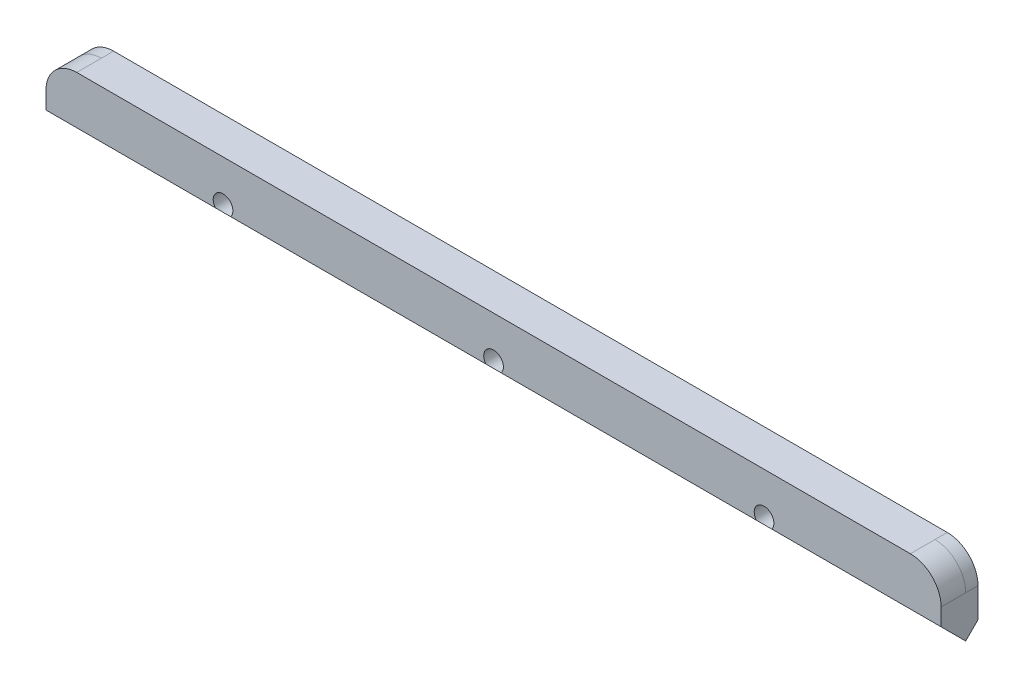
ISO-10303-21;
HEADER;
FILE_DESCRIPTION(('STEP AP214'),'2;1');
FILE_NAME('part.step','',(''),(''),'','','');
FILE_SCHEMA(('AUTOMOTIVE_DESIGN { 1 0 10303 214 1 1 1 1 }'));
ENDSEC;
DATA;
#1=APPLICATION_CONTEXT('core data for automotive mechanical design processes');
#2=APPLICATION_PROTOCOL_DEFINITION('international standard','automotive_design',2000,#1);
#3=PRODUCT_CONTEXT('',#1,'mechanical');
#4=PRODUCT('Part','Part','',(#3));
#5=PRODUCT_RELATED_PRODUCT_CATEGORY('part','',(#4));
#6=PRODUCT_DEFINITION_FORMATION('','',#4);
#7=PRODUCT_DEFINITION_CONTEXT('part definition',#1,'design');
#8=PRODUCT_DEFINITION('design','',#6,#7);
#9=PRODUCT_DEFINITION_SHAPE('','',#8);
#10=(LENGTH_UNIT() NAMED_UNIT(*) SI_UNIT(.MILLI.,.METRE.));
#11=(NAMED_UNIT(*) PLANE_ANGLE_UNIT() SI_UNIT($,.RADIAN.));
#12=(NAMED_UNIT(*) SI_UNIT($,.STERADIAN.) SOLID_ANGLE_UNIT());
#13=UNCERTAINTY_MEASURE_WITH_UNIT(LENGTH_MEASURE(1.E-05),#10,'distance_accuracy_value','');
#14=(GEOMETRIC_REPRESENTATION_CONTEXT(3) GLOBAL_UNCERTAINTY_ASSIGNED_CONTEXT((#13)) GLOBAL_UNIT_ASSIGNED_CONTEXT((#10,
#11,#12)) REPRESENTATION_CONTEXT('',''));
#15=CARTESIAN_POINT('',(0.,0.,0.));
#16=DIRECTION('',(0.,0.,1.));
#17=DIRECTION('',(1.,0.,0.));
#18=AXIS2_PLACEMENT_3D('',#15,#16,#17);
#19=CARTESIAN_POINT('',(36.4,3.20000000000001,2.00000000000006));
#20=DIRECTION('',(0.,-1.,0.));
#21=DIRECTION('',(0.,0.,-0.999999999999997));
#22=AXIS2_PLACEMENT_3D('',#19,#20,#21);
#23=PLANE('',#22);
#24=DIRECTION('',(-1.,0.,0.));
#25=VECTOR('',#24,1.);
#26=CARTESIAN_POINT('',(42.3841457201509,3.20000000000001,-0.999999999999918));
#27=LINE('',#26,#25);
#28=CARTESIAN_POINT('',(33.9,3.20000000000001,-0.999999999999938));
#29=VERTEX_POINT('',#28);
#30=CARTESIAN_POINT('',(-33.9,3.19999999999999,-1.00000000000005));
#31=VERTEX_POINT('',#30);
#32=EDGE_CURVE('E169',#29,#31,#27,.T.);
#33=ORIENTED_EDGE('',*,*,#32,.T.);
#34=DIRECTION('',(0.,0.,-0.999999999999997));
#35=VECTOR('',#34,1.);
#36=CARTESIAN_POINT('',(-33.9,3.19999999999999,0.));
#37=LINE('',#36,#35);
#38=CARTESIAN_POINT('',(-33.9,3.19999999999999,0.));
#39=VERTEX_POINT('',#38);
#40=EDGE_CURVE('E46',#31,#39,#37,.F.);
#41=ORIENTED_EDGE('',*,*,#40,.T.);
#42=DIRECTION('',(0.,0.,0.999999999999997));
#43=VECTOR('',#42,1.);
#44=CARTESIAN_POINT('',(-33.9,3.19999999999999,1.99999999999995));
#45=LINE('',#44,#43);
#46=CARTESIAN_POINT('',(-33.9,3.19999999999999,1.99999999999995));
#47=VERTEX_POINT('',#46);
#48=EDGE_CURVE('E209',#39,#47,#45,.T.);
#49=ORIENTED_EDGE('',*,*,#48,.T.);
#50=DIRECTION('',(-1.,0.,0.));
#51=VECTOR('',#50,1.);
#52=CARTESIAN_POINT('',(36.4,3.20000000000001,2.00000000000006));
#53=LINE('',#52,#51);
#54=CARTESIAN_POINT('',(33.9,3.20000000000001,2.00000000000006));
#55=VERTEX_POINT('',#54);
#56=EDGE_CURVE('E237',#55,#47,#53,.T.);
#57=ORIENTED_EDGE('',*,*,#56,.F.);
#58=DIRECTION('',(0.,0.,0.999999999999997));
#59=VECTOR('',#58,1.);
#60=CARTESIAN_POINT('',(33.9,3.20000000000001,2.00000000000006));
#61=LINE('',#60,#59);
#62=CARTESIAN_POINT('',(33.9,3.20000000000001,0.));
#63=VERTEX_POINT('',#62);
#64=EDGE_CURVE('E221',#55,#63,#61,.F.);
#65=ORIENTED_EDGE('',*,*,#64,.T.);
#66=DIRECTION('',(0.,0.,0.999999999999997));
#67=VECTOR('',#66,1.);
#68=CARTESIAN_POINT('',(33.9,3.20000000000001,2.00000000000006));
#69=LINE('',#68,#67);
#70=EDGE_CURVE('E60',#63,#29,#69,.F.);
#71=ORIENTED_EDGE('',*,*,#70,.T.);
#72=EDGE_LOOP('',(#33,#41,#49,#57,#65,#71));
#73=FACE_BOUND('',#72,.T.);
#74=ADVANCED_FACE('F38',(#73),#23,.F.);
#75=CARTESIAN_POINT('',(36.4,-1.19999999999999,2.00000000000006));
#76=DIRECTION('',(0.,0.,-0.999999999999997));
#77=DIRECTION('',(-1.,0.,0.));
#78=AXIS2_PLACEMENT_3D('',#75,#76,#77);
#79=PLANE('',#78);
#80=DIRECTION('',(-1.,0.,0.));
#81=VECTOR('',#80,1.);
#82=CARTESIAN_POINT('',(39.6015621187164,-0.699999999999992,2.00000000000006));
#83=LINE('',#82,#81);
#84=CARTESIAN_POINT('',(-22.6244997998393,-0.700000000000006,1.99999999999997));
#85=VERTEX_POINT('',#84);
#86=CARTESIAN_POINT('',(-36.4,-0.700000000000006,1.99999999999994));
#87=VERTEX_POINT('',#86);
#88=EDGE_CURVE('E142',#85,#87,#83,.T.);
#89=ORIENTED_EDGE('',*,*,#88,.F.);
#90=CARTESIAN_POINT('',(-21.9999999999997,-0.199999999999756,1.99999999999997));
#91=DIRECTION('',(0.,0.,0.999999999999997));
#92=DIRECTION('',(1.,0.,0.));
#93=AXIS2_PLACEMENT_3D('',#90,#91,#92);
#94=CIRCLE('',#93,0.799999999999988);
#95=CARTESIAN_POINT('',(-21.3755002001601,-0.700000000000006,1.99999999999997));
#96=VERTEX_POINT('',#95);
#97=EDGE_CURVE('E129',#96,#85,#94,.T.);
#98=ORIENTED_EDGE('',*,*,#97,.F.);
#99=CARTESIAN_POINT('',(-0.62449979983963,-0.699999999999992,2.));
#100=VERTEX_POINT('',#99);
#101=EDGE_CURVE('E140',#100,#96,#83,.T.);
#102=ORIENTED_EDGE('',*,*,#101,.F.);
#103=CARTESIAN_POINT('',(0.,-0.199999999999756,2.));
#104=DIRECTION('',(0.,0.,0.999999999999997));
#105=DIRECTION('',(1.,0.,0.));
#106=AXIS2_PLACEMENT_3D('',#103,#104,#105);
#107=CIRCLE('',#106,0.79999999999999);
#108=CARTESIAN_POINT('',(0.624499799839636,-0.699999999999992,2.));
#109=VERTEX_POINT('',#108);
#110=EDGE_CURVE('E185',#109,#100,#107,.T.);
#111=ORIENTED_EDGE('',*,*,#110,.F.);
#112=CARTESIAN_POINT('',(21.3755002001606,-0.699999999999992,2.00000000000003));
#113=VERTEX_POINT('',#112);
#114=EDGE_CURVE('E148',#113,#109,#83,.T.);
#115=ORIENTED_EDGE('',*,*,#114,.F.);
#116=CARTESIAN_POINT('',(22.0000000000003,-0.199999999999756,2.00000000000003));
#117=DIRECTION('',(0.,0.,0.999999999999997));
#118=DIRECTION('',(1.,0.,0.));
#119=AXIS2_PLACEMENT_3D('',#116,#117,#118);
#120=CIRCLE('',#119,0.799999999999992);
#121=CARTESIAN_POINT('',(22.6244997998399,-0.699999999999992,2.00000000000003));
#122=VERTEX_POINT('',#121);
#123=EDGE_CURVE('E190',#122,#113,#120,.T.);
#124=ORIENTED_EDGE('',*,*,#123,.F.);
#125=CARTESIAN_POINT('',(36.4,-0.699999999999992,2.00000000000006));
#126=VERTEX_POINT('',#125);
#127=EDGE_CURVE('E150',#126,#122,#83,.T.);
#128=ORIENTED_EDGE('',*,*,#127,.F.);
#129=DIRECTION('',(0.,-1.,0.));
#130=VECTOR('',#129,1.);
#131=CARTESIAN_POINT('',(36.4,-1.19999999999999,2.00000000000006));
#132=LINE('',#131,#130);
#133=CARTESIAN_POINT('',(36.4,0.700000000000006,2.00000000000006));
#134=VERTEX_POINT('',#133);
#135=EDGE_CURVE('E239',#134,#126,#132,.T.);
#136=ORIENTED_EDGE('',*,*,#135,.F.);
#137=CARTESIAN_POINT('',(33.9,0.700000000000006,2.00000000000006));
#138=DIRECTION('',(0.,0.,-0.999999999999997));
#139=DIRECTION('',(-1.,0.,0.));
#140=AXIS2_PLACEMENT_3D('',#137,#138,#139);
#141=CIRCLE('',#140,2.5);
#142=EDGE_CURVE('E220',#134,#55,#141,.F.);
#143=ORIENTED_EDGE('',*,*,#142,.T.);
#144=ORIENTED_EDGE('',*,*,#56,.T.);
#145=CARTESIAN_POINT('',(-33.9,0.699999999999992,1.99999999999995));
#146=DIRECTION('',(0.,0.,-0.999999999999997));
#147=DIRECTION('',(-1.,0.,0.));
#148=AXIS2_PLACEMENT_3D('',#145,#146,#147);
#149=CIRCLE('',#148,2.5);
#150=CARTESIAN_POINT('',(-36.4,0.699999999999992,1.99999999999994));
#151=VERTEX_POINT('',#150);
#152=EDGE_CURVE('E219',#47,#151,#149,.F.);
#153=ORIENTED_EDGE('',*,*,#152,.T.);
#154=DIRECTION('',(0.,-1.,0.));
#155=VECTOR('',#154,1.);
#156=CARTESIAN_POINT('',(-36.4,-1.20000000000001,1.99999999999994));
#157=LINE('',#156,#155);
#158=EDGE_CURVE('E164',#151,#87,#157,.T.);
#159=ORIENTED_EDGE('',*,*,#158,.T.);
#160=EDGE_LOOP('',(#89,#98,#102,#111,#115,#124,#128,#136,#143,#144,#153,#159));
#161=FACE_BOUND('',#160,.T.);
#162=ADVANCED_FACE('F138',(#161),#79,.F.);
#163=CARTESIAN_POINT('',(36.4,0.,0.));
#164=DIRECTION('',(-1.,0.,0.));
#165=DIRECTION('',(0.,0.,0.999999999999997));
#166=AXIS2_PLACEMENT_3D('',#163,#164,#165);
#167=PLANE('',#166);
#168=DIRECTION('',(0.,1.,0.));
#169=VECTOR('',#168,1.);
#170=CARTESIAN_POINT('',(36.4,-1.69999999999999,-0.999999999999945));
#171=LINE('',#170,#169);
#172=CARTESIAN_POINT('',(36.4,-1.69999999999999,-0.999999999999945));
#173=VERTEX_POINT('',#172);
#174=CARTESIAN_POINT('',(36.4,0.700000000000006,-0.999999999999945));
#175=VERTEX_POINT('',#174);
#176=EDGE_CURVE('E175',#173,#175,#171,.T.);
#177=ORIENTED_EDGE('',*,*,#176,.T.);
#178=DIRECTION('',(0.,0.,0.999999999999997));
#179=VECTOR('',#178,1.);
#180=CARTESIAN_POINT('',(36.4,0.700000000000006,0.));
#181=LINE('',#180,#179);
#182=CARTESIAN_POINT('',(36.4,0.700000000000006,0.));
#183=VERTEX_POINT('',#182);
#184=EDGE_CURVE('E11',#175,#183,#181,.T.);
#185=ORIENTED_EDGE('',*,*,#184,.T.);
#186=DIRECTION('',(0.,0.,0.999999999999997));
#187=VECTOR('',#186,1.);
#188=CARTESIAN_POINT('',(36.4,0.700000000000006,0.));
#189=LINE('',#188,#187);
#190=EDGE_CURVE('E224',#183,#134,#189,.T.);
#191=ORIENTED_EDGE('',*,*,#190,.T.);
#192=ORIENTED_EDGE('',*,*,#135,.T.);
#193=DIRECTION('',(0.,0.707106781186549,0.707106781186546));
#194=VECTOR('',#193,1.);
#195=CARTESIAN_POINT('',(36.4,-2.69999999999999,0.));
#196=LINE('',#195,#194);
#197=CARTESIAN_POINT('',(36.4,-2.69999999999999,0.));
#198=VERTEX_POINT('',#197);
#199=EDGE_CURVE('E159',#198,#126,#196,.T.);
#200=ORIENTED_EDGE('',*,*,#199,.F.);
#201=DIRECTION('',(0.,0.707106781186552,-0.707106781186542));
#202=VECTOR('',#201,1.);
#203=CARTESIAN_POINT('',(36.4,-2.69999999999999,0.));
#204=LINE('',#203,#202);
#205=EDGE_CURVE('E167',#198,#173,#204,.T.);
#206=ORIENTED_EDGE('',*,*,#205,.T.);
#207=EDGE_LOOP('',(#177,#185,#191,#192,#200,#206));
#208=FACE_BOUND('',#207,.T.);
#209=ADVANCED_FACE('F244',(#208),#167,.F.);
#210=CARTESIAN_POINT('',(-36.4,0.,0.));
#211=DIRECTION('',(-1.,0.,0.));
#212=DIRECTION('',(0.,0.,0.999999999999997));
#213=AXIS2_PLACEMENT_3D('',#210,#211,#212);
#214=PLANE('',#213);
#215=DIRECTION('',(0.,0.,0.999999999999997));
#216=VECTOR('',#215,1.);
#217=CARTESIAN_POINT('',(-36.4,0.699999999999992,0.));
#218=LINE('',#217,#216);
#219=CARTESIAN_POINT('',(-36.4,0.699999999999992,0.));
#220=VERTEX_POINT('',#219);
#221=EDGE_CURVE('E229',#151,#220,#218,.F.);
#222=ORIENTED_EDGE('',*,*,#221,.T.);
#223=DIRECTION('',(0.,0.,-0.999999999999997));
#224=VECTOR('',#223,1.);
#225=CARTESIAN_POINT('',(-36.4,0.699999999999992,-1.00000000000006));
#226=LINE('',#225,#224);
#227=CARTESIAN_POINT('',(-36.4,0.699999999999992,-1.00000000000006));
#228=VERTEX_POINT('',#227);
#229=EDGE_CURVE('E133',#220,#228,#226,.T.);
#230=ORIENTED_EDGE('',*,*,#229,.T.);
#231=DIRECTION('',(0.,-1.,0.));
#232=VECTOR('',#231,1.);
#233=CARTESIAN_POINT('',(-36.4,-1.69999999999999,-1.00000000000006));
#234=LINE('',#233,#232);
#235=CARTESIAN_POINT('',(-36.4,-1.69999999999999,-1.00000000000006));
#236=VERTEX_POINT('',#235);
#237=EDGE_CURVE('E177',#228,#236,#234,.T.);
#238=ORIENTED_EDGE('',*,*,#237,.T.);
#239=DIRECTION('',(0.,-0.707106781186552,0.707106781186542));
#240=VECTOR('',#239,1.);
#241=CARTESIAN_POINT('',(-36.4,-2.70000000000001,0.));
#242=LINE('',#241,#240);
#243=CARTESIAN_POINT('',(-36.4,-2.70000000000001,0.));
#244=VERTEX_POINT('',#243);
#245=EDGE_CURVE('E172',#236,#244,#242,.T.);
#246=ORIENTED_EDGE('',*,*,#245,.T.);
#247=DIRECTION('',(0.,-0.707106781186549,-0.707106781186546));
#248=VECTOR('',#247,1.);
#249=CARTESIAN_POINT('',(-36.4,-2.70000000000001,0.));
#250=LINE('',#249,#248);
#251=EDGE_CURVE('E151',#87,#244,#250,.T.);
#252=ORIENTED_EDGE('',*,*,#251,.F.);
#253=ORIENTED_EDGE('',*,*,#158,.F.);
#254=EDGE_LOOP('',(#222,#230,#238,#246,#252,#253));
#255=FACE_BOUND('',#254,.T.);
#256=ADVANCED_FACE('F275',(#255),#214,.T.);
#257=CARTESIAN_POINT('',(-33.9,0.699999999999992,1.99999999999995));
#258=DIRECTION('',(0.,0.,-0.999999999999997));
#259=DIRECTION('',(-1.,0.,0.));
#260=AXIS2_PLACEMENT_3D('',#257,#258,#259);
#261=CYLINDRICAL_SURFACE('',#260,2.5);
#262=CARTESIAN_POINT('',(-33.9,0.699999999999992,0.));
#263=DIRECTION('',(0.,0.,0.999999999999997));
#264=DIRECTION('',(1.,0.,0.));
#265=AXIS2_PLACEMENT_3D('',#262,#263,#264);
#266=CIRCLE('',#265,2.5);
#267=EDGE_CURVE('E217',#220,#39,#266,.F.);
#268=ORIENTED_EDGE('',*,*,#267,.F.);
#269=ORIENTED_EDGE('',*,*,#221,.F.);
#270=ORIENTED_EDGE('',*,*,#152,.F.);
#271=ORIENTED_EDGE('',*,*,#48,.F.);
#272=EDGE_LOOP('',(#268,#269,#270,#271));
#273=FACE_BOUND('',#272,.T.);
#274=ADVANCED_FACE('F215',(#273),#261,.T.);
#275=CARTESIAN_POINT('',(33.9,0.700000000000006,0.));
#276=DIRECTION('',(0.,0.,0.999999999999997));
#277=DIRECTION('',(1.,0.,0.));
#278=AXIS2_PLACEMENT_3D('',#275,#276,#277);
#279=CYLINDRICAL_SURFACE('',#278,2.5);
#280=CARTESIAN_POINT('',(33.9,0.700000000000006,0.));
#281=DIRECTION('',(0.,0.,0.999999999999997));
#282=DIRECTION('',(1.,0.,0.));
#283=AXIS2_PLACEMENT_3D('',#280,#281,#282);
#284=CIRCLE('',#283,2.5);
#285=EDGE_CURVE('E225',#63,#183,#284,.F.);
#286=ORIENTED_EDGE('',*,*,#285,.F.);
#287=ORIENTED_EDGE('',*,*,#64,.F.);
#288=ORIENTED_EDGE('',*,*,#142,.F.);
#289=ORIENTED_EDGE('',*,*,#190,.F.);
#290=EDGE_LOOP('',(#286,#287,#288,#289));
#291=FACE_BOUND('',#290,.T.);
#292=ADVANCED_FACE('F274',(#291),#279,.T.);
#293=CARTESIAN_POINT('',(39.6015621187164,-2.69999999999999,0.));
#294=DIRECTION('',(0.,0.707106781186548,-0.707106781186546));
#295=DIRECTION('',(0.,0.707106781186549,0.707106781186546));
#296=AXIS2_PLACEMENT_3D('',#293,#294,#295);
#297=PLANE('',#296);
#298=ORIENTED_EDGE('',*,*,#101,.T.);
#299=CARTESIAN_POINT('',(-21.9999999999997,-0.199999999999756,2.50000000000021));
#300=DIRECTION('',(0.,0.707106781186548,-0.707106781186546));
#301=DIRECTION('',(0.,0.707106781186549,0.707106781186546));
#302=AXIS2_PLACEMENT_3D('',#299,#300,#301);
#303=ELLIPSE('',#302,1.13137084989846,0.799999999999988);
#304=EDGE_CURVE('E126',#96,#85,#303,.T.);
#305=ORIENTED_EDGE('',*,*,#304,.T.);
#306=ORIENTED_EDGE('',*,*,#88,.T.);
#307=ORIENTED_EDGE('',*,*,#251,.T.);
#308=DIRECTION('',(-1.,0.,0.));
#309=VECTOR('',#308,1.);
#310=CARTESIAN_POINT('',(39.6015621187164,-2.69999999999999,0.));
#311=LINE('',#310,#309);
#312=EDGE_CURVE('E155',#198,#244,#311,.T.);
#313=ORIENTED_EDGE('',*,*,#312,.F.);
#314=ORIENTED_EDGE('',*,*,#199,.T.);
#315=ORIENTED_EDGE('',*,*,#127,.T.);
#316=CARTESIAN_POINT('',(22.0000000000003,-0.199999999999756,2.50000000000027));
#317=DIRECTION('',(0.,0.707106781186548,-0.707106781186546));
#318=DIRECTION('',(0.,0.707106781186549,0.707106781186546));
#319=AXIS2_PLACEMENT_3D('',#316,#317,#318);
#320=ELLIPSE('',#319,1.13137084989846,0.79999999999999);
#321=EDGE_CURVE('E187',#122,#113,#320,.T.);
#322=ORIENTED_EDGE('',*,*,#321,.T.);
#323=ORIENTED_EDGE('',*,*,#114,.T.);
#324=CARTESIAN_POINT('',(0.,-0.199999999999756,2.50000000000025));
#325=DIRECTION('',(0.,0.707106781186548,-0.707106781186546));
#326=DIRECTION('',(0.,0.707106781186549,0.707106781186546));
#327=AXIS2_PLACEMENT_3D('',#324,#325,#326);
#328=ELLIPSE('',#327,1.13137084989846,0.799999999999989);
#329=EDGE_CURVE('E134',#109,#100,#328,.T.);
#330=ORIENTED_EDGE('',*,*,#329,.T.);
#331=EDGE_LOOP('',(#298,#305,#306,#307,#313,#314,#315,#322,#323,#330));
#332=FACE_BOUND('',#331,.T.);
#333=ADVANCED_FACE('F146',(#332),#297,.F.);
#334=CARTESIAN_POINT('',(42.3841457201509,-2.69999999999999,0.));
#335=DIRECTION('',(0.,-0.707106781186545,-0.707106781186549));
#336=DIRECTION('',(0.,0.707106781186552,-0.707106781186542));
#337=AXIS2_PLACEMENT_3D('',#334,#335,#336);
#338=PLANE('',#337);
#339=ORIENTED_EDGE('',*,*,#205,.F.);
#340=ORIENTED_EDGE('',*,*,#312,.T.);
#341=ORIENTED_EDGE('',*,*,#245,.F.);
#342=DIRECTION('',(-1.,0.,0.));
#343=VECTOR('',#342,1.);
#344=CARTESIAN_POINT('',(42.3841457201509,-1.69999999999999,-0.999999999999931));
#345=LINE('',#344,#343);
#346=EDGE_CURVE('E171',#173,#236,#345,.T.);
#347=ORIENTED_EDGE('',*,*,#346,.F.);
#348=EDGE_LOOP('',(#339,#340,#341,#347));
#349=FACE_BOUND('',#348,.T.);
#350=ADVANCED_FACE('F260',(#349),#338,.T.);
#351=CARTESIAN_POINT('',(42.3841457201509,-1.69999999999999,-0.999999999999931));
#352=DIRECTION('',(0.,0.,-0.999999999999997));
#353=DIRECTION('',(-1.,0.,0.));
#354=AXIS2_PLACEMENT_3D('',#351,#352,#353);
#355=PLANE('',#354);
#356=CARTESIAN_POINT('',(-21.9999999999997,-0.199999999999756,-1.00000000000003));
#357=DIRECTION('',(0.,0.,-0.999999999999997));
#358=DIRECTION('',(-1.,0.,0.));
#359=AXIS2_PLACEMENT_3D('',#356,#357,#358);
#360=CIRCLE('',#359,0.799999999999988);
#361=CARTESIAN_POINT('',(-22.7999999999997,-0.199999999999756,-1.00000000000003));
#362=VERTEX_POINT('',#361);
#363=EDGE_CURVE('E143',#362,#362,#360,.T.);
#364=ORIENTED_EDGE('',*,*,#363,.F.);
#365=EDGE_LOOP('',(#364));
#366=FACE_BOUND('',#365,.T.);
#367=CARTESIAN_POINT('',(22.0000000000003,-0.199999999999756,-0.999999999999973));
#368=DIRECTION('',(0.,0.,-0.999999999999997));
#369=DIRECTION('',(-1.,0.,0.));
#370=AXIS2_PLACEMENT_3D('',#367,#368,#369);
#371=CIRCLE('',#370,0.79999999999999);
#372=CARTESIAN_POINT('',(21.2000000000003,-0.199999999999756,-0.999999999999974));
#373=VERTEX_POINT('',#372);
#374=EDGE_CURVE('E189',#373,#373,#371,.T.);
#375=ORIENTED_EDGE('',*,*,#374,.F.);
#376=EDGE_LOOP('',(#375));
#377=FACE_BOUND('',#376,.T.);
#378=CARTESIAN_POINT('',(0.,-0.199999999999756,-1.));
#379=DIRECTION('',(0.,0.,-0.999999999999997));
#380=DIRECTION('',(-1.,0.,0.));
#381=AXIS2_PLACEMENT_3D('',#378,#379,#380);
#382=CIRCLE('',#381,0.799999999999989);
#383=CARTESIAN_POINT('',(-0.79999999999999,-0.199999999999756,-1.));
#384=VERTEX_POINT('',#383);
#385=EDGE_CURVE('E179',#384,#384,#382,.T.);
#386=ORIENTED_EDGE('',*,*,#385,.F.);
#387=EDGE_LOOP('',(#386));
#388=FACE_BOUND('',#387,.T.);
#389=ORIENTED_EDGE('',*,*,#237,.F.);
#390=CARTESIAN_POINT('',(-33.9,0.699999999999992,-1.00000000000006));
#391=DIRECTION('',(0.,0.,-0.999999999999997));
#392=DIRECTION('',(-1.,0.,0.));
#393=AXIS2_PLACEMENT_3D('',#390,#391,#392);
#394=CIRCLE('',#393,2.5);
#395=EDGE_CURVE('E53',#228,#31,#394,.T.);
#396=ORIENTED_EDGE('',*,*,#395,.T.);
#397=ORIENTED_EDGE('',*,*,#32,.F.);
#398=CARTESIAN_POINT('',(33.9,0.700000000000006,-0.999999999999945));
#399=DIRECTION('',(0.,0.,-0.999999999999997));
#400=DIRECTION('',(-1.,0.,0.));
#401=AXIS2_PLACEMENT_3D('',#398,#399,#400);
#402=CIRCLE('',#401,2.5);
#403=EDGE_CURVE('E202',#29,#175,#402,.T.);
#404=ORIENTED_EDGE('',*,*,#403,.T.);
#405=ORIENTED_EDGE('',*,*,#176,.F.);
#406=ORIENTED_EDGE('',*,*,#346,.T.);
#407=EDGE_LOOP('',(#389,#396,#397,#404,#405,#406));
#408=FACE_BOUND('',#407,.T.);
#409=ADVANCED_FACE('F251',(#366,#377,#388,#408),#355,.T.);
#410=CARTESIAN_POINT('',(0.,-0.199999999999756,2.));
#411=DIRECTION('',(0.,0.,0.999999999999997));
#412=DIRECTION('',(1.,0.,0.));
#413=AXIS2_PLACEMENT_3D('',#410,#411,#412);
#414=CYLINDRICAL_SURFACE('',#413,0.799999999999989);
#415=ORIENTED_EDGE('',*,*,#385,.T.);
#416=EDGE_LOOP('',(#415));
#417=FACE_BOUND('',#416,.T.);
#418=ORIENTED_EDGE('',*,*,#110,.T.);
#419=ORIENTED_EDGE('',*,*,#329,.F.);
#420=EDGE_LOOP('',(#418,#419));
#421=FACE_BOUND('',#420,.T.);
#422=ADVANCED_FACE('F248',(#417,#421),#414,.F.);
#423=CARTESIAN_POINT('',(22.0000000000003,-0.199999999999756,2.00000000000003));
#424=DIRECTION('',(0.,0.,0.999999999999997));
#425=DIRECTION('',(1.,0.,0.));
#426=AXIS2_PLACEMENT_3D('',#423,#424,#425);
#427=CYLINDRICAL_SURFACE('',#426,0.79999999999999);
#428=ORIENTED_EDGE('',*,*,#374,.T.);
#429=EDGE_LOOP('',(#428));
#430=FACE_BOUND('',#429,.T.);
#431=ORIENTED_EDGE('',*,*,#123,.T.);
#432=ORIENTED_EDGE('',*,*,#321,.F.);
#433=EDGE_LOOP('',(#431,#432));
#434=FACE_BOUND('',#433,.T.);
#435=ADVANCED_FACE('F250',(#430,#434),#427,.F.);
#436=CARTESIAN_POINT('',(-21.9999999999997,-0.199999999999756,1.99999999999997));
#437=DIRECTION('',(0.,0.,0.999999999999997));
#438=DIRECTION('',(1.,0.,0.));
#439=AXIS2_PLACEMENT_3D('',#436,#437,#438);
#440=CYLINDRICAL_SURFACE('',#439,0.799999999999988);
#441=ORIENTED_EDGE('',*,*,#363,.T.);
#442=EDGE_LOOP('',(#441));
#443=FACE_BOUND('',#442,.T.);
#444=ORIENTED_EDGE('',*,*,#97,.T.);
#445=ORIENTED_EDGE('',*,*,#304,.F.);
#446=EDGE_LOOP('',(#444,#445));
#447=FACE_BOUND('',#446,.T.);
#448=ADVANCED_FACE('F128',(#443,#447),#440,.F.);
#449=CARTESIAN_POINT('',(-33.9,0.699999999999992,0.));
#450=DIRECTION('',(0.,0.,0.999999999999997));
#451=DIRECTION('',(1.,0.,0.));
#452=AXIS2_PLACEMENT_3D('',#449,#450,#451);
#453=CYLINDRICAL_SURFACE('',#452,2.5);
#454=ORIENTED_EDGE('',*,*,#267,.T.);
#455=ORIENTED_EDGE('',*,*,#40,.F.);
#456=ORIENTED_EDGE('',*,*,#395,.F.);
#457=ORIENTED_EDGE('',*,*,#229,.F.);
#458=EDGE_LOOP('',(#454,#455,#456,#457));
#459=FACE_BOUND('',#458,.T.);
#460=ADVANCED_FACE('F223',(#459),#453,.T.);
#461=CARTESIAN_POINT('',(33.9,0.700000000000006,0.));
#462=DIRECTION('',(0.,0.,0.999999999999997));
#463=DIRECTION('',(1.,0.,0.));
#464=AXIS2_PLACEMENT_3D('',#461,#462,#463);
#465=CYLINDRICAL_SURFACE('',#464,2.5);
#466=ORIENTED_EDGE('',*,*,#403,.F.);
#467=ORIENTED_EDGE('',*,*,#70,.F.);
#468=ORIENTED_EDGE('',*,*,#285,.T.);
#469=ORIENTED_EDGE('',*,*,#184,.F.);
#470=EDGE_LOOP('',(#466,#467,#468,#469));
#471=FACE_BOUND('',#470,.T.);
#472=ADVANCED_FACE('F40',(#471),#465,.T.);
#473=CLOSED_SHELL('',(#74,#162,#209,#256,#274,#292,#333,#350,#409,#422,#435,#448,#460,#472));
#474=MANIFOLD_SOLID_BREP('B2',#473);
#475=ADVANCED_BREP_SHAPE_REPRESENTATION('',(#18,#474),#14);
#476=SHAPE_DEFINITION_REPRESENTATION(#9,#475);
ENDSEC;
END-ISO-10303-21;
